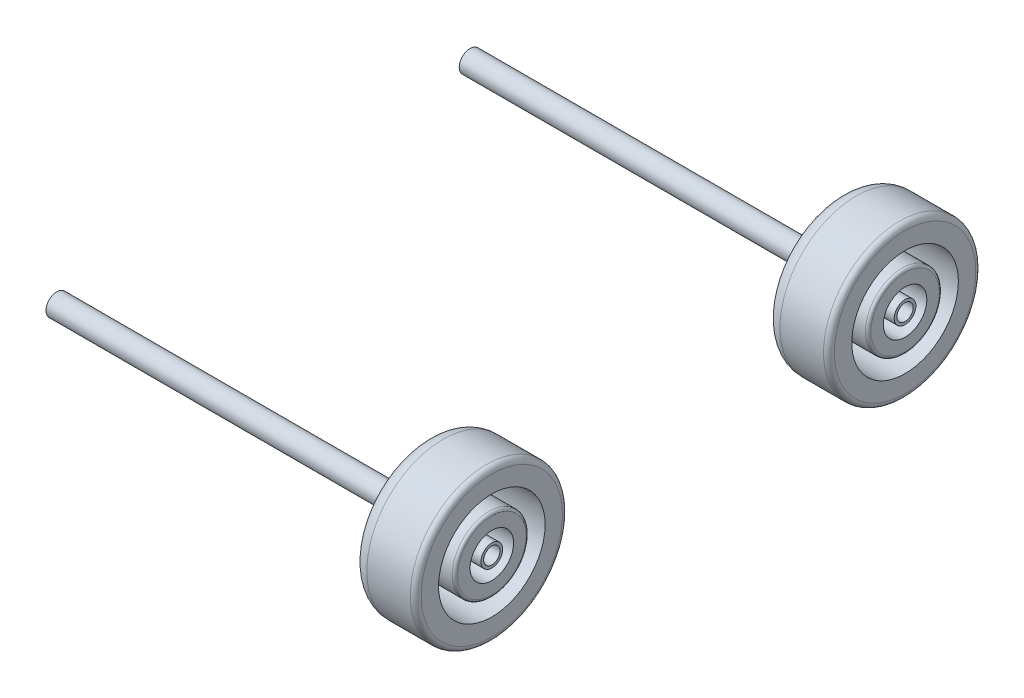
ISO-10303-21;
HEADER;
FILE_DESCRIPTION(('STEP AP214'),'2;1');
FILE_NAME('part.step','',(''),(''),'','','');
FILE_SCHEMA(('AUTOMOTIVE_DESIGN { 1 0 10303 214 1 1 1 1 }'));
ENDSEC;
DATA;
#1=APPLICATION_CONTEXT('core data for automotive mechanical design processes');
#2=APPLICATION_PROTOCOL_DEFINITION('international standard','automotive_design',2000,#1);
#3=PRODUCT_CONTEXT('',#1,'mechanical');
#4=PRODUCT('Part','Part','',(#3));
#5=PRODUCT_RELATED_PRODUCT_CATEGORY('part','',(#4));
#6=PRODUCT_DEFINITION_FORMATION('','',#4);
#7=PRODUCT_DEFINITION_CONTEXT('part definition',#1,'design');
#8=PRODUCT_DEFINITION('design','',#6,#7);
#9=PRODUCT_DEFINITION_SHAPE('','',#8);
#10=(LENGTH_UNIT() NAMED_UNIT(*) SI_UNIT(.MILLI.,.METRE.));
#11=(NAMED_UNIT(*) PLANE_ANGLE_UNIT() SI_UNIT($,.RADIAN.));
#12=(NAMED_UNIT(*) SI_UNIT($,.STERADIAN.) SOLID_ANGLE_UNIT());
#13=UNCERTAINTY_MEASURE_WITH_UNIT(LENGTH_MEASURE(1.E-05),#10,'distance_accuracy_value','');
#14=(GEOMETRIC_REPRESENTATION_CONTEXT(3) GLOBAL_UNCERTAINTY_ASSIGNED_CONTEXT((#13)) GLOBAL_UNIT_ASSIGNED_CONTEXT((#10,
#11,#12)) REPRESENTATION_CONTEXT('',''));
#15=CARTESIAN_POINT('',(0.,0.,0.));
#16=DIRECTION('',(0.,0.,1.));
#17=DIRECTION('',(1.,0.,0.));
#18=AXIS2_PLACEMENT_3D('',#15,#16,#17);
#19=CARTESIAN_POINT('',(0.,0.380134398129842,-38.));
#20=DIRECTION('',(1.,0.,0.));
#21=DIRECTION('',(0.,0.,-1.));
#22=AXIS2_PLACEMENT_3D('',#19,#20,#21);
#23=CYLINDRICAL_SURFACE('',#22,4.9);
#24=CARTESIAN_POINT('',(6.,0.380134398129842,-38.));
#25=DIRECTION('',(1.,0.,0.));
#26=DIRECTION('',(0.,0.,-1.));
#27=AXIS2_PLACEMENT_3D('',#24,#25,#26);
#28=CIRCLE('',#27,4.9);
#29=CARTESIAN_POINT('',(6.,0.380134398129842,-42.9));
#30=VERTEX_POINT('',#29);
#31=EDGE_CURVE('E70',#30,#30,#28,.T.);
#32=ORIENTED_EDGE('',*,*,#31,.T.);
#33=EDGE_LOOP('',(#32));
#34=FACE_BOUND('',#33,.T.);
#35=CARTESIAN_POINT('',(1.,0.380134398129842,-38.));
#36=DIRECTION('',(-1.,0.,0.));
#37=DIRECTION('',(0.,0.,1.));
#38=AXIS2_PLACEMENT_3D('',#35,#36,#37);
#39=CIRCLE('',#38,4.9);
#40=CARTESIAN_POINT('',(1.,0.380134398129842,-33.1));
#41=VERTEX_POINT('',#40);
#42=EDGE_CURVE('E67',#41,#41,#39,.F.);
#43=ORIENTED_EDGE('',*,*,#42,.F.);
#44=EDGE_LOOP('',(#43));
#45=FACE_BOUND('',#44,.T.);
#46=ADVANCED_FACE('F47',(#34,#45),#23,.F.);
#47=CARTESIAN_POINT('',(0.,0.380134398129842,-38.));
#48=DIRECTION('',(1.,0.,0.));
#49=DIRECTION('',(0.,0.,-1.));
#50=AXIS2_PLACEMENT_3D('',#47,#48,#49);
#51=CYLINDRICAL_SURFACE('',#50,7.);
#52=CARTESIAN_POINT('',(5.5,0.380134398129842,-38.));
#53=DIRECTION('',(1.,0.,0.));
#54=DIRECTION('',(0.,0.,-1.));
#55=AXIS2_PLACEMENT_3D('',#52,#53,#54);
#56=CIRCLE('',#55,7.);
#57=CARTESIAN_POINT('',(5.5,0.380134398129842,-45.));
#58=VERTEX_POINT('',#57);
#59=EDGE_CURVE('E11',#58,#58,#56,.F.);
#60=ORIENTED_EDGE('',*,*,#59,.T.);
#61=EDGE_LOOP('',(#60));
#62=FACE_BOUND('',#61,.T.);
#63=CARTESIAN_POINT('',(1.5,0.380134398129842,-38.));
#64=DIRECTION('',(1.,0.,0.));
#65=DIRECTION('',(0.,0.,-1.));
#66=AXIS2_PLACEMENT_3D('',#63,#64,#65);
#67=CIRCLE('',#66,7.);
#68=CARTESIAN_POINT('',(1.5,0.380134398129842,-45.));
#69=VERTEX_POINT('',#68);
#70=EDGE_CURVE('E62',#69,#69,#67,.T.);
#71=ORIENTED_EDGE('',*,*,#70,.T.);
#72=EDGE_LOOP('',(#71));
#73=FACE_BOUND('',#72,.T.);
#74=ADVANCED_FACE('F85',(#62,#73),#51,.T.);
#75=CARTESIAN_POINT('',(0.,0.380134398129842,-38.));
#76=DIRECTION('',(1.,0.,0.));
#77=DIRECTION('',(0.,0.,-1.));
#78=AXIS2_PLACEMENT_3D('',#75,#76,#77);
#79=PLANE('',#78);
#80=CARTESIAN_POINT('',(0.,0.380134398129842,-38.));
#81=DIRECTION('',(1.,0.,0.));
#82=DIRECTION('',(0.,0.,-1.));
#83=AXIS2_PLACEMENT_3D('',#80,#81,#82);
#84=CIRCLE('',#83,5.5);
#85=CARTESIAN_POINT('',(0.,0.380134398129842,-43.5));
#86=VERTEX_POINT('',#85);
#87=EDGE_CURVE('E58',#86,#86,#84,.F.);
#88=ORIENTED_EDGE('',*,*,#87,.T.);
#89=EDGE_LOOP('',(#88));
#90=FACE_BOUND('',#89,.T.);
#91=CARTESIAN_POINT('',(0.,0.380134398129842,-38.));
#92=DIRECTION('',(-1.,0.,0.));
#93=DIRECTION('',(0.,0.,1.));
#94=AXIS2_PLACEMENT_3D('',#91,#92,#93);
#95=CIRCLE('',#94,3.4);
#96=CARTESIAN_POINT('',(0.,0.380134398129842,-34.6));
#97=VERTEX_POINT('',#96);
#98=EDGE_CURVE('E73',#97,#97,#95,.T.);
#99=ORIENTED_EDGE('',*,*,#98,.F.);
#100=EDGE_LOOP('',(#99));
#101=FACE_BOUND('',#100,.T.);
#102=ADVANCED_FACE('F82',(#90,#101),#79,.F.);
#103=CARTESIAN_POINT('',(6.,0.380134398129842,-38.));
#104=DIRECTION('',(1.,0.,0.));
#105=DIRECTION('',(0.,0.,-1.));
#106=AXIS2_PLACEMENT_3D('',#103,#104,#105);
#107=PLANE('',#106);
#108=CARTESIAN_POINT('',(6.,0.380134398129842,-38.));
#109=DIRECTION('',(1.,0.,0.));
#110=DIRECTION('',(0.,0.,-1.));
#111=AXIS2_PLACEMENT_3D('',#108,#109,#110);
#112=CIRCLE('',#111,6.5);
#113=CARTESIAN_POINT('',(6.,0.380134398129842,-44.5));
#114=VERTEX_POINT('',#113);
#115=EDGE_CURVE('E54',#114,#114,#112,.T.);
#116=ORIENTED_EDGE('',*,*,#115,.T.);
#117=EDGE_LOOP('',(#116));
#118=FACE_BOUND('',#117,.T.);
#119=ORIENTED_EDGE('',*,*,#31,.F.);
#120=EDGE_LOOP('',(#119));
#121=FACE_BOUND('',#120,.T.);
#122=ADVANCED_FACE('F84',(#118,#121),#107,.T.);
#123=CARTESIAN_POINT('',(1.,0.380134398129842,-38.));
#124=DIRECTION('',(-1.,0.,0.));
#125=DIRECTION('',(0.,0.,1.));
#126=AXIS2_PLACEMENT_3D('',#123,#124,#125);
#127=PLANE('',#126);
#128=CARTESIAN_POINT('',(1.,0.380134398129842,-38.));
#129=DIRECTION('',(-1.,0.,0.));
#130=DIRECTION('',(0.,0.,1.));
#131=AXIS2_PLACEMENT_3D('',#128,#129,#130);
#132=CIRCLE('',#131,3.4);
#133=CARTESIAN_POINT('',(1.,0.380134398129842,-34.6));
#134=VERTEX_POINT('',#133);
#135=EDGE_CURVE('E74',#134,#134,#132,.T.);
#136=ORIENTED_EDGE('',*,*,#135,.T.);
#137=EDGE_LOOP('',(#136));
#138=FACE_BOUND('',#137,.T.);
#139=ORIENTED_EDGE('',*,*,#42,.T.);
#140=EDGE_LOOP('',(#139));
#141=FACE_BOUND('',#140,.T.);
#142=ADVANCED_FACE('F92',(#138,#141),#127,.F.);
#143=CARTESIAN_POINT('',(1.,0.380134398129842,-38.));
#144=DIRECTION('',(-1.,0.,0.));
#145=DIRECTION('',(0.,0.,1.));
#146=AXIS2_PLACEMENT_3D('',#143,#144,#145);
#147=CYLINDRICAL_SURFACE('',#146,3.4);
#148=ORIENTED_EDGE('',*,*,#135,.F.);
#149=EDGE_LOOP('',(#148));
#150=FACE_BOUND('',#149,.T.);
#151=ORIENTED_EDGE('',*,*,#98,.T.);
#152=EDGE_LOOP('',(#151));
#153=FACE_BOUND('',#152,.T.);
#154=ADVANCED_FACE('F80',(#150,#153),#147,.F.);
#155=CARTESIAN_POINT('',(1.5,0.380134398129842,-38.));
#156=DIRECTION('',(1.,0.,0.));
#157=DIRECTION('',(0.,0.,-1.));
#158=AXIS2_PLACEMENT_3D('',#155,#156,#157);
#159=TOROIDAL_SURFACE('',#158,5.5,1.5);
#160=ORIENTED_EDGE('',*,*,#87,.F.);
#161=EDGE_LOOP('',(#160));
#162=FACE_BOUND('',#161,.T.);
#163=ORIENTED_EDGE('',*,*,#70,.F.);
#164=EDGE_LOOP('',(#163));
#165=FACE_BOUND('',#164,.T.);
#166=ADVANCED_FACE('F101',(#162,#165),#159,.T.);
#167=CARTESIAN_POINT('',(5.5,0.380134398129842,-38.));
#168=DIRECTION('',(1.,0.,0.));
#169=DIRECTION('',(0.,0.,-1.));
#170=AXIS2_PLACEMENT_3D('',#167,#168,#169);
#171=TOROIDAL_SURFACE('',#170,6.5,0.5);
#172=ORIENTED_EDGE('',*,*,#59,.F.);
#173=EDGE_LOOP('',(#172));
#174=FACE_BOUND('',#173,.T.);
#175=ORIENTED_EDGE('',*,*,#115,.F.);
#176=EDGE_LOOP('',(#175));
#177=FACE_BOUND('',#176,.T.);
#178=ADVANCED_FACE('F49',(#174,#177),#171,.T.);
#179=CLOSED_SHELL('',(#46,#74,#102,#122,#142,#154,#166,#178));
#180=MANIFOLD_SOLID_BREP('B2',#179);
#181=CARTESIAN_POINT('',(6.,0.380134398129842,-38.));
#182=DIRECTION('',(-1.,0.,0.));
#183=DIRECTION('',(0.,0.,1.));
#184=AXIS2_PLACEMENT_3D('',#181,#182,#183);
#185=CYLINDRICAL_SURFACE('',#184,2.);
#186=CARTESIAN_POINT('',(6.,0.380134398129842,-38.));
#187=DIRECTION('',(1.,0.,0.));
#188=DIRECTION('',(0.,0.,-1.));
#189=AXIS2_PLACEMENT_3D('',#186,#187,#188);
#190=CIRCLE('',#189,2.);
#191=CARTESIAN_POINT('',(6.,0.380134398129842,-40.));
#192=VERTEX_POINT('',#191);
#193=EDGE_CURVE('E207',#192,#192,#190,.T.);
#194=ORIENTED_EDGE('',*,*,#193,.T.);
#195=EDGE_LOOP('',(#194));
#196=FACE_BOUND('',#195,.T.);
#197=CARTESIAN_POINT('',(1.,0.380134398129842,-38.));
#198=DIRECTION('',(-1.,0.,0.));
#199=DIRECTION('',(0.,0.,1.));
#200=AXIS2_PLACEMENT_3D('',#197,#198,#199);
#201=CIRCLE('',#200,2.);
#202=CARTESIAN_POINT('',(1.,0.380134398129842,-36.));
#203=VERTEX_POINT('',#202);
#204=EDGE_CURVE('E216',#203,#203,#201,.T.);
#205=ORIENTED_EDGE('',*,*,#204,.T.);
#206=EDGE_LOOP('',(#205));
#207=FACE_BOUND('',#206,.T.);
#208=ADVANCED_FACE('F196',(#196,#207),#185,.F.);
#209=CARTESIAN_POINT('',(6.,0.380134398129842,-38.));
#210=DIRECTION('',(1.,0.,0.));
#211=DIRECTION('',(0.,0.,-1.));
#212=AXIS2_PLACEMENT_3D('',#209,#210,#211);
#213=PLANE('',#212);
#214=CARTESIAN_POINT('',(6.,0.380134398129842,-38.));
#215=DIRECTION('',(1.,0.,0.));
#216=DIRECTION('',(0.,0.,-1.));
#217=AXIS2_PLACEMENT_3D('',#214,#215,#216);
#218=CIRCLE('',#217,3.15);
#219=CARTESIAN_POINT('',(6.,0.380134398129842,-41.15));
#220=VERTEX_POINT('',#219);
#221=EDGE_CURVE('E203',#220,#220,#218,.T.);
#222=ORIENTED_EDGE('',*,*,#221,.T.);
#223=EDGE_LOOP('',(#222));
#224=FACE_BOUND('',#223,.T.);
#225=ORIENTED_EDGE('',*,*,#193,.F.);
#226=EDGE_LOOP('',(#225));
#227=FACE_BOUND('',#226,.T.);
#228=ADVANCED_FACE('F267',(#224,#227),#213,.T.);
#229=CARTESIAN_POINT('',(0.,0.380134398129842,-38.));
#230=DIRECTION('',(1.,0.,0.));
#231=DIRECTION('',(0.,0.,-1.));
#232=AXIS2_PLACEMENT_3D('',#229,#230,#231);
#233=PLANE('',#232);
#234=CARTESIAN_POINT('',(0.,0.380134398129842,-38.));
#235=DIRECTION('',(1.,0.,0.));
#236=DIRECTION('',(0.,0.,-1.));
#237=AXIS2_PLACEMENT_3D('',#234,#235,#236);
#238=CIRCLE('',#237,3.4);
#239=CARTESIAN_POINT('',(0.,0.380134398129842,-41.4));
#240=VERTEX_POINT('',#239);
#241=EDGE_CURVE('E211',#240,#240,#238,.T.);
#242=ORIENTED_EDGE('',*,*,#241,.F.);
#243=EDGE_LOOP('',(#242));
#244=FACE_BOUND('',#243,.T.);
#245=CARTESIAN_POINT('',(0.,0.380134398129842,-38.));
#246=DIRECTION('',(-1.,0.,0.));
#247=DIRECTION('',(0.,0.,1.));
#248=AXIS2_PLACEMENT_3D('',#245,#246,#247);
#249=CIRCLE('',#248,0.999999999999998);
#250=CARTESIAN_POINT('',(0.,0.380134398129842,-37.));
#251=VERTEX_POINT('',#250);
#252=EDGE_CURVE('E219',#251,#251,#249,.T.);
#253=ORIENTED_EDGE('',*,*,#252,.F.);
#254=EDGE_LOOP('',(#253));
#255=FACE_BOUND('',#254,.T.);
#256=ADVANCED_FACE('F272',(#244,#255),#233,.F.);
#257=CARTESIAN_POINT('',(6.,0.380134398129842,-38.));
#258=DIRECTION('',(-1.,0.,0.));
#259=DIRECTION('',(0.,0.,1.));
#260=AXIS2_PLACEMENT_3D('',#257,#258,#259);
#261=CYLINDRICAL_SURFACE('',#260,3.4);
#262=CARTESIAN_POINT('',(5.75,0.380134398129842,-38.));
#263=DIRECTION('',(1.,0.,0.));
#264=DIRECTION('',(0.,0.,-1.));
#265=AXIS2_PLACEMENT_3D('',#262,#263,#264);
#266=CIRCLE('',#265,3.4);
#267=CARTESIAN_POINT('',(5.75,0.380134398129842,-41.4));
#268=VERTEX_POINT('',#267);
#269=EDGE_CURVE('E46',#268,#268,#266,.F.);
#270=ORIENTED_EDGE('',*,*,#269,.T.);
#271=EDGE_LOOP('',(#270));
#272=FACE_BOUND('',#271,.T.);
#273=ORIENTED_EDGE('',*,*,#241,.T.);
#274=EDGE_LOOP('',(#273));
#275=FACE_BOUND('',#274,.T.);
#276=ADVANCED_FACE('F277',(#272,#275),#261,.T.);
#277=CARTESIAN_POINT('',(5.75,0.380134398129842,-38.));
#278=DIRECTION('',(1.,0.,0.));
#279=DIRECTION('',(0.,0.,-1.));
#280=AXIS2_PLACEMENT_3D('',#277,#278,#279);
#281=TOROIDAL_SURFACE('',#280,3.15,0.25);
#282=ORIENTED_EDGE('',*,*,#269,.F.);
#283=EDGE_LOOP('',(#282));
#284=FACE_BOUND('',#283,.T.);
#285=ORIENTED_EDGE('',*,*,#221,.F.);
#286=EDGE_LOOP('',(#285));
#287=FACE_BOUND('',#286,.T.);
#288=ADVANCED_FACE('F198',(#284,#287),#281,.T.);
#289=CARTESIAN_POINT('',(1.,0.380134398129842,-38.));
#290=DIRECTION('',(-1.,0.,0.));
#291=DIRECTION('',(0.,0.,1.));
#292=AXIS2_PLACEMENT_3D('',#289,#290,#291);
#293=PLANE('',#292);
#294=CARTESIAN_POINT('',(1.,0.380134398129842,-38.));
#295=DIRECTION('',(-1.,0.,0.));
#296=DIRECTION('',(0.,0.,1.));
#297=AXIS2_PLACEMENT_3D('',#294,#295,#296);
#298=CIRCLE('',#297,0.999999999999998);
#299=CARTESIAN_POINT('',(1.,0.380134398129842,-37.));
#300=VERTEX_POINT('',#299);
#301=EDGE_CURVE('E222',#300,#300,#298,.T.);
#302=ORIENTED_EDGE('',*,*,#301,.T.);
#303=EDGE_LOOP('',(#302));
#304=FACE_BOUND('',#303,.T.);
#305=ORIENTED_EDGE('',*,*,#204,.F.);
#306=EDGE_LOOP('',(#305));
#307=FACE_BOUND('',#306,.T.);
#308=ADVANCED_FACE('F260',(#304,#307),#293,.F.);
#309=CARTESIAN_POINT('',(-34.,0.380134398129842,-38.));
#310=DIRECTION('',(1.,0.,0.));
#311=DIRECTION('',(0.,0.,-1.));
#312=AXIS2_PLACEMENT_3D('',#309,#310,#311);
#313=CYLINDRICAL_SURFACE('',#312,0.999999999999998);
#314=CARTESIAN_POINT('',(-34.,0.380134398129842,-38.));
#315=DIRECTION('',(1.,0.,0.));
#316=DIRECTION('',(0.,0.,-1.));
#317=AXIS2_PLACEMENT_3D('',#314,#315,#316);
#318=CIRCLE('',#317,0.999999999999998);
#319=CARTESIAN_POINT('',(-34.,0.380134398129842,-39.));
#320=VERTEX_POINT('',#319);
#321=EDGE_CURVE('E225',#320,#320,#318,.T.);
#322=ORIENTED_EDGE('',*,*,#321,.T.);
#323=EDGE_LOOP('',(#322));
#324=FACE_BOUND('',#323,.T.);
#325=ORIENTED_EDGE('',*,*,#252,.T.);
#326=EDGE_LOOP('',(#325));
#327=FACE_BOUND('',#326,.T.);
#328=ADVANCED_FACE('F256',(#324,#327),#313,.T.);
#329=CARTESIAN_POINT('',(6.,0.380134398129842,-38.));
#330=DIRECTION('',(1.,0.,0.));
#331=DIRECTION('',(0.,0.,-1.));
#332=AXIS2_PLACEMENT_3D('',#329,#330,#331);
#333=CIRCLE('',#332,0.999999999999998);
#334=CARTESIAN_POINT('',(6.,0.380134398129842,-39.));
#335=VERTEX_POINT('',#334);
#336=EDGE_CURVE('E226',#335,#335,#333,.T.);
#337=ORIENTED_EDGE('',*,*,#336,.F.);
#338=EDGE_LOOP('',(#337));
#339=FACE_BOUND('',#338,.T.);
#340=ORIENTED_EDGE('',*,*,#301,.F.);
#341=EDGE_LOOP('',(#340));
#342=FACE_BOUND('',#341,.T.);
#343=ADVANCED_FACE('F253',(#339,#342),#313,.T.);
#344=CARTESIAN_POINT('',(-34.,0.380134398129842,-38.));
#345=DIRECTION('',(1.,0.,0.));
#346=DIRECTION('',(0.,0.,-1.));
#347=AXIS2_PLACEMENT_3D('',#344,#345,#346);
#348=PLANE('',#347);
#349=CARTESIAN_POINT('',(-34.,0.380134398129842,-38.));
#350=DIRECTION('',(1.,0.,0.));
#351=DIRECTION('',(0.,0.,-1.));
#352=AXIS2_PLACEMENT_3D('',#349,#350,#351);
#353=CIRCLE('',#352,0.749999999999999);
#354=CARTESIAN_POINT('',(-34.,0.380134398129842,-38.75));
#355=VERTEX_POINT('',#354);
#356=EDGE_CURVE('E229',#355,#355,#353,.T.);
#357=ORIENTED_EDGE('',*,*,#356,.T.);
#358=EDGE_LOOP('',(#357));
#359=FACE_BOUND('',#358,.T.);
#360=ORIENTED_EDGE('',*,*,#321,.F.);
#361=EDGE_LOOP('',(#360));
#362=FACE_BOUND('',#361,.T.);
#363=ADVANCED_FACE('F238',(#359,#362),#348,.F.);
#364=CARTESIAN_POINT('',(6.,0.380134398129842,-38.));
#365=DIRECTION('',(1.,0.,0.));
#366=DIRECTION('',(0.,0.,-1.));
#367=AXIS2_PLACEMENT_3D('',#364,#365,#366);
#368=PLANE('',#367);
#369=CARTESIAN_POINT('',(6.,0.380134398129842,-38.));
#370=DIRECTION('',(1.,0.,0.));
#371=DIRECTION('',(0.,0.,-1.));
#372=AXIS2_PLACEMENT_3D('',#369,#370,#371);
#373=CIRCLE('',#372,0.749999999999999);
#374=CARTESIAN_POINT('',(6.,0.380134398129842,-38.75));
#375=VERTEX_POINT('',#374);
#376=EDGE_CURVE('E232',#375,#375,#373,.T.);
#377=ORIENTED_EDGE('',*,*,#376,.F.);
#378=EDGE_LOOP('',(#377));
#379=FACE_BOUND('',#378,.T.);
#380=ORIENTED_EDGE('',*,*,#336,.T.);
#381=EDGE_LOOP('',(#380));
#382=FACE_BOUND('',#381,.T.);
#383=ADVANCED_FACE('F244',(#379,#382),#368,.T.);
#384=CARTESIAN_POINT('',(-34.,0.380134398129842,-38.));
#385=DIRECTION('',(1.,0.,0.));
#386=DIRECTION('',(0.,0.,-1.));
#387=AXIS2_PLACEMENT_3D('',#384,#385,#386);
#388=CYLINDRICAL_SURFACE('',#387,0.749999999999999);
#389=ORIENTED_EDGE('',*,*,#356,.F.);
#390=EDGE_LOOP('',(#389));
#391=FACE_BOUND('',#390,.T.);
#392=ORIENTED_EDGE('',*,*,#376,.T.);
#393=EDGE_LOOP('',(#392));
#394=FACE_BOUND('',#393,.T.);
#395=ADVANCED_FACE('F241',(#391,#394),#388,.F.);
#396=CLOSED_SHELL('',(#208,#228,#256,#276,#288,#308,#328,#343,#363,#383,#395));
#397=MANIFOLD_SOLID_BREP('B6',#396);
#398=CARTESIAN_POINT('',(6.,0.,0.));
#399=DIRECTION('',(-1.,0.,0.));
#400=DIRECTION('',(0.,0.,1.));
#401=AXIS2_PLACEMENT_3D('',#398,#399,#400);
#402=CYLINDRICAL_SURFACE('',#401,3.4);
#403=CARTESIAN_POINT('',(5.75,0.,0.));
#404=DIRECTION('',(1.,0.,0.));
#405=DIRECTION('',(0.,0.,-1.));
#406=AXIS2_PLACEMENT_3D('',#403,#404,#405);
#407=CIRCLE('',#406,3.4);
#408=CARTESIAN_POINT('',(5.75,0.,-3.4));
#409=VERTEX_POINT('',#408);
#410=EDGE_CURVE('E411',#409,#409,#407,.F.);
#411=ORIENTED_EDGE('',*,*,#410,.T.);
#412=EDGE_LOOP('',(#411));
#413=FACE_BOUND('',#412,.T.);
#414=CARTESIAN_POINT('',(1.,0.,0.));
#415=DIRECTION('',(-1.,0.,0.));
#416=DIRECTION('',(0.,0.,1.));
#417=AXIS2_PLACEMENT_3D('',#414,#415,#416);
#418=CIRCLE('',#417,3.4);
#419=CARTESIAN_POINT('',(1.,0.,3.4));
#420=VERTEX_POINT('',#419);
#421=EDGE_CURVE('E408',#420,#420,#418,.T.);
#422=ORIENTED_EDGE('',*,*,#421,.F.);
#423=EDGE_LOOP('',(#422));
#424=FACE_BOUND('',#423,.T.);
#425=ADVANCED_FACE('F388',(#413,#424),#402,.T.);
#426=CARTESIAN_POINT('',(6.,0.,0.));
#427=DIRECTION('',(-1.,0.,0.));
#428=DIRECTION('',(0.,0.,1.));
#429=AXIS2_PLACEMENT_3D('',#426,#427,#428);
#430=CYLINDRICAL_SURFACE('',#429,2.);
#431=CARTESIAN_POINT('',(6.,0.,0.));
#432=DIRECTION('',(1.,0.,0.));
#433=DIRECTION('',(0.,0.,-1.));
#434=AXIS2_PLACEMENT_3D('',#431,#432,#433);
#435=CIRCLE('',#434,2.);
#436=CARTESIAN_POINT('',(6.,0.,-2.));
#437=VERTEX_POINT('',#436);
#438=EDGE_CURVE('E417',#437,#437,#435,.T.);
#439=ORIENTED_EDGE('',*,*,#438,.T.);
#440=EDGE_LOOP('',(#439));
#441=FACE_BOUND('',#440,.T.);
#442=CARTESIAN_POINT('',(2.,0.,0.));
#443=DIRECTION('',(-1.,0.,0.));
#444=DIRECTION('',(0.,0.,1.));
#445=AXIS2_PLACEMENT_3D('',#442,#443,#444);
#446=CIRCLE('',#445,2.);
#447=CARTESIAN_POINT('',(2.,0.,2.));
#448=VERTEX_POINT('',#447);
#449=EDGE_CURVE('E420',#448,#448,#446,.T.);
#450=ORIENTED_EDGE('',*,*,#449,.T.);
#451=EDGE_LOOP('',(#450));
#452=FACE_BOUND('',#451,.T.);
#453=ADVANCED_FACE('F464',(#441,#452),#430,.F.);
#454=CARTESIAN_POINT('',(6.,0.,0.));
#455=DIRECTION('',(1.,0.,0.));
#456=DIRECTION('',(0.,0.,-1.));
#457=AXIS2_PLACEMENT_3D('',#454,#455,#456);
#458=PLANE('',#457);
#459=CARTESIAN_POINT('',(6.,0.,0.));
#460=DIRECTION('',(1.,0.,0.));
#461=DIRECTION('',(0.,0.,-1.));
#462=AXIS2_PLACEMENT_3D('',#459,#460,#461);
#463=CIRCLE('',#462,3.15);
#464=CARTESIAN_POINT('',(6.,0.,-3.15));
#465=VERTEX_POINT('',#464);
#466=EDGE_CURVE('E414',#465,#465,#463,.T.);
#467=ORIENTED_EDGE('',*,*,#466,.T.);
#468=EDGE_LOOP('',(#467));
#469=FACE_BOUND('',#468,.T.);
#470=ORIENTED_EDGE('',*,*,#438,.F.);
#471=EDGE_LOOP('',(#470));
#472=FACE_BOUND('',#471,.T.);
#473=ADVANCED_FACE('F470',(#469,#472),#458,.T.);
#474=CARTESIAN_POINT('',(0.,0.,0.));
#475=DIRECTION('',(1.,0.,0.));
#476=DIRECTION('',(0.,0.,-1.));
#477=AXIS2_PLACEMENT_3D('',#474,#475,#476);
#478=PLANE('',#477);
#479=CARTESIAN_POINT('',(0.,0.,0.));
#480=DIRECTION('',(1.,0.,0.));
#481=DIRECTION('',(0.,0.,-1.));
#482=AXIS2_PLACEMENT_3D('',#479,#480,#481);
#483=CIRCLE('',#482,5.5);
#484=CARTESIAN_POINT('',(0.,0.,-5.5));
#485=VERTEX_POINT('',#484);
#486=EDGE_CURVE('E399',#485,#485,#483,.F.);
#487=ORIENTED_EDGE('',*,*,#486,.T.);
#488=EDGE_LOOP('',(#487));
#489=FACE_BOUND('',#488,.T.);
#490=CARTESIAN_POINT('',(0.,0.,0.));
#491=DIRECTION('',(-1.,0.,0.));
#492=DIRECTION('',(0.,0.,1.));
#493=AXIS2_PLACEMENT_3D('',#490,#491,#492);
#494=CIRCLE('',#493,1.);
#495=CARTESIAN_POINT('',(0.,0.,1.));
#496=VERTEX_POINT('',#495);
#497=EDGE_CURVE('E423',#496,#496,#494,.T.);
#498=ORIENTED_EDGE('',*,*,#497,.F.);
#499=EDGE_LOOP('',(#498));
#500=FACE_BOUND('',#499,.T.);
#501=ADVANCED_FACE('F476',(#489,#500),#478,.F.);
#502=CARTESIAN_POINT('',(2.,0.,0.));
#503=DIRECTION('',(-1.,0.,0.));
#504=DIRECTION('',(0.,0.,1.));
#505=AXIS2_PLACEMENT_3D('',#502,#503,#504);
#506=PLANE('',#505);
#507=CARTESIAN_POINT('',(1.99999999999999,0.,0.));
#508=DIRECTION('',(-1.,0.,0.));
#509=DIRECTION('',(0.,0.,1.));
#510=AXIS2_PLACEMENT_3D('',#507,#508,#509);
#511=CIRCLE('',#510,1.);
#512=CARTESIAN_POINT('',(1.99999999999999,0.,1.));
#513=VERTEX_POINT('',#512);
#514=EDGE_CURVE('E426',#513,#513,#511,.T.);
#515=ORIENTED_EDGE('',*,*,#514,.T.);
#516=EDGE_LOOP('',(#515));
#517=FACE_BOUND('',#516,.T.);
#518=ORIENTED_EDGE('',*,*,#449,.F.);
#519=EDGE_LOOP('',(#518));
#520=FACE_BOUND('',#519,.T.);
#521=ADVANCED_FACE('F481',(#517,#520),#506,.F.);
#522=CARTESIAN_POINT('',(5.75,0.,0.));
#523=DIRECTION('',(1.,0.,0.));
#524=DIRECTION('',(0.,0.,-1.));
#525=AXIS2_PLACEMENT_3D('',#522,#523,#524);
#526=TOROIDAL_SURFACE('',#525,3.15,0.25);
#527=ORIENTED_EDGE('',*,*,#410,.F.);
#528=EDGE_LOOP('',(#527));
#529=FACE_BOUND('',#528,.T.);
#530=ORIENTED_EDGE('',*,*,#466,.F.);
#531=EDGE_LOOP('',(#530));
#532=FACE_BOUND('',#531,.T.);
#533=ADVANCED_FACE('F478',(#529,#532),#526,.T.);
#534=CARTESIAN_POINT('',(-34.,0.,0.));
#535=DIRECTION('',(1.,0.,0.));
#536=DIRECTION('',(0.,0.,-1.));
#537=AXIS2_PLACEMENT_3D('',#534,#535,#536);
#538=CYLINDRICAL_SURFACE('',#537,1.);
#539=CARTESIAN_POINT('',(-34.,0.,0.));
#540=DIRECTION('',(1.,0.,0.));
#541=DIRECTION('',(0.,0.,-1.));
#542=AXIS2_PLACEMENT_3D('',#539,#540,#541);
#543=CIRCLE('',#542,1.);
#544=CARTESIAN_POINT('',(-34.,0.,-1.));
#545=VERTEX_POINT('',#544);
#546=EDGE_CURVE('E429',#545,#545,#543,.T.);
#547=ORIENTED_EDGE('',*,*,#546,.T.);
#548=EDGE_LOOP('',(#547));
#549=FACE_BOUND('',#548,.T.);
#550=ORIENTED_EDGE('',*,*,#497,.T.);
#551=EDGE_LOOP('',(#550));
#552=FACE_BOUND('',#551,.T.);
#553=ADVANCED_FACE('F480',(#549,#552),#538,.T.);
#554=CARTESIAN_POINT('',(6.,0.,0.));
#555=DIRECTION('',(1.,0.,0.));
#556=DIRECTION('',(0.,0.,-1.));
#557=AXIS2_PLACEMENT_3D('',#554,#555,#556);
#558=CIRCLE('',#557,1.);
#559=CARTESIAN_POINT('',(6.,0.,-1.));
#560=VERTEX_POINT('',#559);
#561=EDGE_CURVE('E430',#560,#560,#558,.T.);
#562=ORIENTED_EDGE('',*,*,#561,.F.);
#563=EDGE_LOOP('',(#562));
#564=FACE_BOUND('',#563,.T.);
#565=ORIENTED_EDGE('',*,*,#514,.F.);
#566=EDGE_LOOP('',(#565));
#567=FACE_BOUND('',#566,.T.);
#568=ADVANCED_FACE('F487',(#564,#567),#538,.T.);
#569=CARTESIAN_POINT('',(-34.,0.,0.));
#570=DIRECTION('',(1.,0.,0.));
#571=DIRECTION('',(0.,0.,-1.));
#572=AXIS2_PLACEMENT_3D('',#569,#570,#571);
#573=PLANE('',#572);
#574=CARTESIAN_POINT('',(-34.,0.,0.));
#575=DIRECTION('',(1.,0.,0.));
#576=DIRECTION('',(0.,0.,-1.));
#577=AXIS2_PLACEMENT_3D('',#574,#575,#576);
#578=CIRCLE('',#577,0.75);
#579=CARTESIAN_POINT('',(-34.,0.,-0.75));
#580=VERTEX_POINT('',#579);
#581=EDGE_CURVE('E433',#580,#580,#578,.T.);
#582=ORIENTED_EDGE('',*,*,#581,.T.);
#583=EDGE_LOOP('',(#582));
#584=FACE_BOUND('',#583,.T.);
#585=ORIENTED_EDGE('',*,*,#546,.F.);
#586=EDGE_LOOP('',(#585));
#587=FACE_BOUND('',#586,.T.);
#588=ADVANCED_FACE('F511',(#584,#587),#573,.F.);
#589=CARTESIAN_POINT('',(6.,0.,0.));
#590=DIRECTION('',(1.,0.,0.));
#591=DIRECTION('',(0.,0.,-1.));
#592=AXIS2_PLACEMENT_3D('',#589,#590,#591);
#593=PLANE('',#592);
#594=CARTESIAN_POINT('',(6.,0.,0.));
#595=DIRECTION('',(1.,0.,0.));
#596=DIRECTION('',(0.,0.,-1.));
#597=AXIS2_PLACEMENT_3D('',#594,#595,#596);
#598=CIRCLE('',#597,0.75);
#599=CARTESIAN_POINT('',(6.,0.,-0.75));
#600=VERTEX_POINT('',#599);
#601=EDGE_CURVE('E436',#600,#600,#598,.T.);
#602=ORIENTED_EDGE('',*,*,#601,.F.);
#603=EDGE_LOOP('',(#602));
#604=FACE_BOUND('',#603,.T.);
#605=ORIENTED_EDGE('',*,*,#561,.T.);
#606=EDGE_LOOP('',(#605));
#607=FACE_BOUND('',#606,.T.);
#608=ADVANCED_FACE('F507',(#604,#607),#593,.T.);
#609=CARTESIAN_POINT('',(-34.,0.,0.));
#610=DIRECTION('',(1.,0.,0.));
#611=DIRECTION('',(0.,0.,-1.));
#612=AXIS2_PLACEMENT_3D('',#609,#610,#611);
#613=CYLINDRICAL_SURFACE('',#612,0.75);
#614=ORIENTED_EDGE('',*,*,#581,.F.);
#615=EDGE_LOOP('',(#614));
#616=FACE_BOUND('',#615,.T.);
#617=ORIENTED_EDGE('',*,*,#601,.T.);
#618=EDGE_LOOP('',(#617));
#619=FACE_BOUND('',#618,.T.);
#620=ADVANCED_FACE('F510',(#616,#619),#613,.F.);
#621=CARTESIAN_POINT('',(1.,0.,0.));
#622=DIRECTION('',(-1.,0.,0.));
#623=DIRECTION('',(0.,0.,1.));
#624=AXIS2_PLACEMENT_3D('',#621,#622,#623);
#625=PLANE('',#624);
#626=ORIENTED_EDGE('',*,*,#421,.T.);
#627=EDGE_LOOP('',(#626));
#628=FACE_BOUND('',#627,.T.);
#629=CARTESIAN_POINT('',(1.,0.,0.));
#630=DIRECTION('',(-1.,0.,0.));
#631=DIRECTION('',(0.,0.,1.));
#632=AXIS2_PLACEMENT_3D('',#629,#630,#631);
#633=CIRCLE('',#632,4.9);
#634=CARTESIAN_POINT('',(1.,0.,4.9));
#635=VERTEX_POINT('',#634);
#636=EDGE_CURVE('E439',#635,#635,#633,.T.);
#637=ORIENTED_EDGE('',*,*,#636,.F.);
#638=EDGE_LOOP('',(#637));
#639=FACE_BOUND('',#638,.T.);
#640=ADVANCED_FACE('F518',(#628,#639),#625,.F.);
#641=CARTESIAN_POINT('',(0.,0.,0.));
#642=DIRECTION('',(1.,0.,0.));
#643=DIRECTION('',(0.,0.,-1.));
#644=AXIS2_PLACEMENT_3D('',#641,#642,#643);
#645=CYLINDRICAL_SURFACE('',#644,4.9);
#646=CARTESIAN_POINT('',(6.,0.,0.));
#647=DIRECTION('',(1.,0.,0.));
#648=DIRECTION('',(0.,0.,-1.));
#649=AXIS2_PLACEMENT_3D('',#646,#647,#648);
#650=CIRCLE('',#649,4.9);
#651=CARTESIAN_POINT('',(6.,0.,-4.9));
#652=VERTEX_POINT('',#651);
#653=EDGE_CURVE('E444',#652,#652,#650,.T.);
#654=ORIENTED_EDGE('',*,*,#653,.T.);
#655=EDGE_LOOP('',(#654));
#656=FACE_BOUND('',#655,.T.);
#657=ORIENTED_EDGE('',*,*,#636,.T.);
#658=EDGE_LOOP('',(#657));
#659=FACE_BOUND('',#658,.T.);
#660=ADVANCED_FACE('F448',(#656,#659),#645,.F.);
#661=CARTESIAN_POINT('',(0.,0.,0.));
#662=DIRECTION('',(1.,0.,0.));
#663=DIRECTION('',(0.,0.,-1.));
#664=AXIS2_PLACEMENT_3D('',#661,#662,#663);
#665=CYLINDRICAL_SURFACE('',#664,7.);
#666=CARTESIAN_POINT('',(5.5,0.,0.));
#667=DIRECTION('',(1.,0.,0.));
#668=DIRECTION('',(0.,0.,-1.));
#669=AXIS2_PLACEMENT_3D('',#666,#667,#668);
#670=CIRCLE('',#669,7.);
#671=CARTESIAN_POINT('',(5.5,0.,-7.));
#672=VERTEX_POINT('',#671);
#673=EDGE_CURVE('E195',#672,#672,#670,.F.);
#674=ORIENTED_EDGE('',*,*,#673,.T.);
#675=EDGE_LOOP('',(#674));
#676=FACE_BOUND('',#675,.T.);
#677=CARTESIAN_POINT('',(1.5,0.,0.));
#678=DIRECTION('',(1.,0.,0.));
#679=DIRECTION('',(0.,0.,-1.));
#680=AXIS2_PLACEMENT_3D('',#677,#678,#679);
#681=CIRCLE('',#680,7.);
#682=CARTESIAN_POINT('',(1.5,0.,-7.));
#683=VERTEX_POINT('',#682);
#684=EDGE_CURVE('E403',#683,#683,#681,.T.);
#685=ORIENTED_EDGE('',*,*,#684,.T.);
#686=EDGE_LOOP('',(#685));
#687=FACE_BOUND('',#686,.T.);
#688=ADVANCED_FACE('F454',(#676,#687),#665,.T.);
#689=CARTESIAN_POINT('',(6.,0.,0.));
#690=DIRECTION('',(1.,0.,0.));
#691=DIRECTION('',(0.,0.,-1.));
#692=AXIS2_PLACEMENT_3D('',#689,#690,#691);
#693=PLANE('',#692);
#694=CARTESIAN_POINT('',(6.,0.,0.));
#695=DIRECTION('',(1.,0.,0.));
#696=DIRECTION('',(0.,0.,-1.));
#697=AXIS2_PLACEMENT_3D('',#694,#695,#696);
#698=CIRCLE('',#697,6.5);
#699=CARTESIAN_POINT('',(6.,0.,-6.5));
#700=VERTEX_POINT('',#699);
#701=EDGE_CURVE('E395',#700,#700,#698,.T.);
#702=ORIENTED_EDGE('',*,*,#701,.T.);
#703=EDGE_LOOP('',(#702));
#704=FACE_BOUND('',#703,.T.);
#705=ORIENTED_EDGE('',*,*,#653,.F.);
#706=EDGE_LOOP('',(#705));
#707=FACE_BOUND('',#706,.T.);
#708=ADVANCED_FACE('F451',(#704,#707),#693,.T.);
#709=CARTESIAN_POINT('',(1.5,0.,0.));
#710=DIRECTION('',(1.,0.,0.));
#711=DIRECTION('',(0.,0.,-1.));
#712=AXIS2_PLACEMENT_3D('',#709,#710,#711);
#713=TOROIDAL_SURFACE('',#712,5.5,1.5);
#714=ORIENTED_EDGE('',*,*,#486,.F.);
#715=EDGE_LOOP('',(#714));
#716=FACE_BOUND('',#715,.T.);
#717=ORIENTED_EDGE('',*,*,#684,.F.);
#718=EDGE_LOOP('',(#717));
#719=FACE_BOUND('',#718,.T.);
#720=ADVANCED_FACE('F453',(#716,#719),#713,.T.);
#721=CARTESIAN_POINT('',(5.5,0.,0.));
#722=DIRECTION('',(1.,0.,0.));
#723=DIRECTION('',(0.,0.,-1.));
#724=AXIS2_PLACEMENT_3D('',#721,#722,#723);
#725=TOROIDAL_SURFACE('',#724,6.5,0.5);
#726=ORIENTED_EDGE('',*,*,#673,.F.);
#727=EDGE_LOOP('',(#726));
#728=FACE_BOUND('',#727,.T.);
#729=ORIENTED_EDGE('',*,*,#701,.F.);
#730=EDGE_LOOP('',(#729));
#731=FACE_BOUND('',#730,.T.);
#732=ADVANCED_FACE('F390',(#728,#731),#725,.T.);
#733=CLOSED_SHELL('',(#425,#453,#473,#501,#521,#533,#553,#568,#588,#608,#620,#640,#660,#688,
#708,#720,#732));
#734=MANIFOLD_SOLID_BREP('B41',#733);
#735=ADVANCED_BREP_SHAPE_REPRESENTATION('',(#18,#180,#397,#734),#14);
#736=SHAPE_DEFINITION_REPRESENTATION(#9,#735);
ENDSEC;
END-ISO-10303-21;
